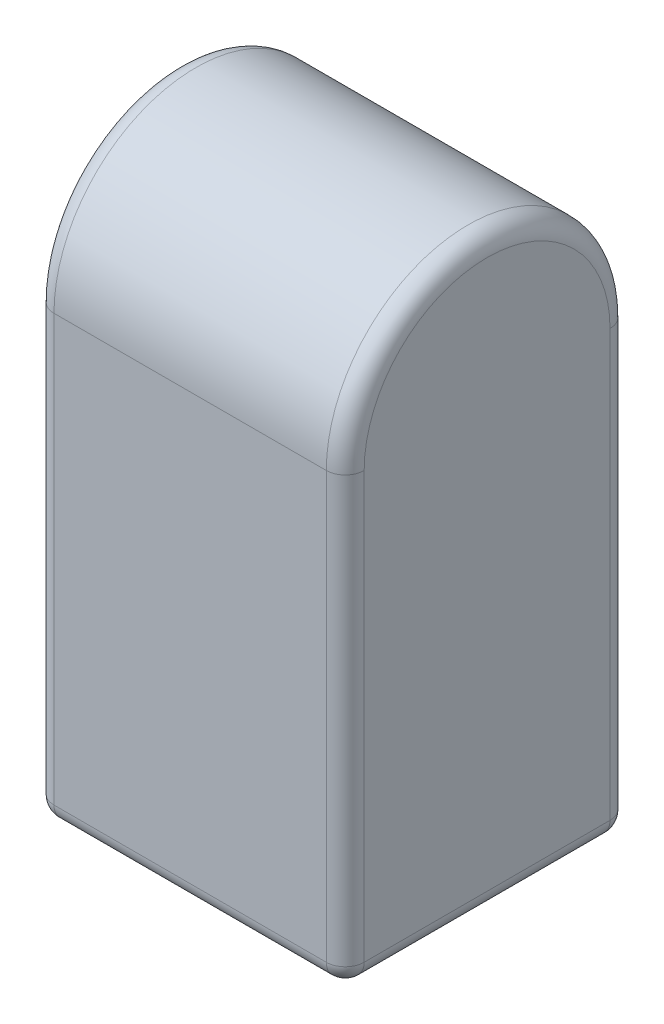
ISO-10303-21;
HEADER;
FILE_DESCRIPTION(('STEP AP214'),'2;1');
FILE_NAME('part.step','',(''),(''),'','','');
FILE_SCHEMA(('AUTOMOTIVE_DESIGN { 1 0 10303 214 1 1 1 1 }'));
ENDSEC;
DATA;
#1=APPLICATION_CONTEXT('core data for automotive mechanical design processes');
#2=APPLICATION_PROTOCOL_DEFINITION('international standard','automotive_design',2000,#1);
#3=PRODUCT_CONTEXT('',#1,'mechanical');
#4=PRODUCT('Part','Part','',(#3));
#5=PRODUCT_RELATED_PRODUCT_CATEGORY('part','',(#4));
#6=PRODUCT_DEFINITION_FORMATION('','',#4);
#7=PRODUCT_DEFINITION_CONTEXT('part definition',#1,'design');
#8=PRODUCT_DEFINITION('design','',#6,#7);
#9=PRODUCT_DEFINITION_SHAPE('','',#8);
#10=(LENGTH_UNIT() NAMED_UNIT(*) SI_UNIT(.MILLI.,.METRE.));
#11=(NAMED_UNIT(*) PLANE_ANGLE_UNIT() SI_UNIT($,.RADIAN.));
#12=(NAMED_UNIT(*) SI_UNIT($,.STERADIAN.) SOLID_ANGLE_UNIT());
#13=UNCERTAINTY_MEASURE_WITH_UNIT(LENGTH_MEASURE(1.E-05),#10,'distance_accuracy_value','');
#14=(GEOMETRIC_REPRESENTATION_CONTEXT(3) GLOBAL_UNCERTAINTY_ASSIGNED_CONTEXT((#13)) GLOBAL_UNIT_ASSIGNED_CONTEXT((#10,
#11,#12)) REPRESENTATION_CONTEXT('',''));
#15=CARTESIAN_POINT('',(0.,0.,0.));
#16=DIRECTION('',(0.,0.,1.));
#17=DIRECTION('',(1.,0.,0.));
#18=AXIS2_PLACEMENT_3D('',#15,#16,#17);
#19=CARTESIAN_POINT('',(16.383,46.99,0.));
#20=DIRECTION('',(-1.,0.,0.));
#21=DIRECTION('',(0.,0.,1.));
#22=AXIS2_PLACEMENT_3D('',#19,#20,#21);
#23=CYLINDRICAL_SURFACE('',#22,14.986);
#24=DIRECTION('',(-1.,0.,0.));
#25=VECTOR('',#24,1.);
#26=CARTESIAN_POINT('',(16.383,46.99,-14.986));
#27=LINE('',#26,#25);
#28=CARTESIAN_POINT('',(14.383,46.99,-14.986));
#29=VERTEX_POINT('',#28);
#30=CARTESIAN_POINT('',(-14.383,46.99,-14.986));
#31=VERTEX_POINT('',#30);
#32=EDGE_CURVE('E119',#29,#31,#27,.T.);
#33=ORIENTED_EDGE('',*,*,#32,.T.);
#34=CARTESIAN_POINT('',(-14.383,46.99,0.));
#35=DIRECTION('',(-1.,0.,0.));
#36=DIRECTION('',(0.,0.,1.));
#37=AXIS2_PLACEMENT_3D('',#34,#35,#36);
#38=CIRCLE('',#37,14.986);
#39=CARTESIAN_POINT('',(-14.383,46.99,14.986));
#40=VERTEX_POINT('',#39);
#41=EDGE_CURVE('E11',#31,#40,#38,.F.);
#42=ORIENTED_EDGE('',*,*,#41,.T.);
#43=DIRECTION('',(-1.,0.,0.));
#44=VECTOR('',#43,1.);
#45=CARTESIAN_POINT('',(16.383,46.99,14.986));
#46=LINE('',#45,#44);
#47=CARTESIAN_POINT('',(14.383,46.99,14.986));
#48=VERTEX_POINT('',#47);
#49=EDGE_CURVE('E121',#48,#40,#46,.T.);
#50=ORIENTED_EDGE('',*,*,#49,.F.);
#51=CARTESIAN_POINT('',(14.383,46.99,0.));
#52=DIRECTION('',(-1.,0.,0.));
#53=DIRECTION('',(0.,0.,1.));
#54=AXIS2_PLACEMENT_3D('',#51,#52,#53);
#55=CIRCLE('',#54,14.986);
#56=EDGE_CURVE('E49',#48,#29,#55,.T.);
#57=ORIENTED_EDGE('',*,*,#56,.T.);
#58=EDGE_LOOP('',(#33,#42,#50,#57));
#59=FACE_BOUND('',#58,.T.);
#60=ADVANCED_FACE('F39',(#59),#23,.T.);
#61=CARTESIAN_POINT('',(16.383,46.99,14.986));
#62=DIRECTION('',(0.,0.,-1.));
#63=DIRECTION('',(0.,1.,0.));
#64=AXIS2_PLACEMENT_3D('',#61,#62,#63);
#65=PLANE('',#64);
#66=ORIENTED_EDGE('',*,*,#49,.T.);
#67=DIRECTION('',(0.,-1.,0.));
#68=VECTOR('',#67,1.);
#69=CARTESIAN_POINT('',(-14.383,0.,14.986));
#70=LINE('',#69,#68);
#71=CARTESIAN_POINT('',(-14.383,2.,14.986));
#72=VERTEX_POINT('',#71);
#73=EDGE_CURVE('E182',#40,#72,#70,.T.);
#74=ORIENTED_EDGE('',*,*,#73,.T.);
#75=DIRECTION('',(-1.,0.,0.));
#76=VECTOR('',#75,1.);
#77=CARTESIAN_POINT('',(16.383,2.,14.986));
#78=LINE('',#77,#76);
#79=CARTESIAN_POINT('',(14.383,2.,14.986));
#80=VERTEX_POINT('',#79);
#81=EDGE_CURVE('E176',#72,#80,#78,.F.);
#82=ORIENTED_EDGE('',*,*,#81,.T.);
#83=DIRECTION('',(0.,-1.,0.));
#84=VECTOR('',#83,1.);
#85=CARTESIAN_POINT('',(14.383,46.99,14.986));
#86=LINE('',#85,#84);
#87=EDGE_CURVE('E179',#80,#48,#86,.F.);
#88=ORIENTED_EDGE('',*,*,#87,.T.);
#89=EDGE_LOOP('',(#66,#74,#82,#88));
#90=FACE_BOUND('',#89,.T.);
#91=ADVANCED_FACE('F288',(#90),#65,.F.);
#92=CARTESIAN_POINT('',(16.383,0.,14.986));
#93=DIRECTION('',(0.,1.,0.));
#94=DIRECTION('',(0.,0.,1.));
#95=AXIS2_PLACEMENT_3D('',#92,#93,#94);
#96=PLANE('',#95);
#97=DIRECTION('',(0.,0.,-1.));
#98=VECTOR('',#97,1.);
#99=CARTESIAN_POINT('',(14.383,0.,14.986));
#100=LINE('',#99,#98);
#101=CARTESIAN_POINT('',(14.383,0.,-12.986));
#102=VERTEX_POINT('',#101);
#103=CARTESIAN_POINT('',(14.383,0.,12.986));
#104=VERTEX_POINT('',#103);
#105=EDGE_CURVE('E57',#102,#104,#100,.F.);
#106=ORIENTED_EDGE('',*,*,#105,.T.);
#107=DIRECTION('',(-1.,0.,0.));
#108=VECTOR('',#107,1.);
#109=CARTESIAN_POINT('',(16.383,0.,12.986));
#110=LINE('',#109,#108);
#111=CARTESIAN_POINT('',(-14.383,0.,12.986));
#112=VERTEX_POINT('',#111);
#113=EDGE_CURVE('E127',#104,#112,#110,.T.);
#114=ORIENTED_EDGE('',*,*,#113,.T.);
#115=DIRECTION('',(0.,0.,-1.));
#116=VECTOR('',#115,1.);
#117=CARTESIAN_POINT('',(-14.383,0.,-14.986));
#118=LINE('',#117,#116);
#119=CARTESIAN_POINT('',(-14.383,0.,-12.986));
#120=VERTEX_POINT('',#119);
#121=EDGE_CURVE('E196',#112,#120,#118,.T.);
#122=ORIENTED_EDGE('',*,*,#121,.T.);
#123=DIRECTION('',(-1.,0.,0.));
#124=VECTOR('',#123,1.);
#125=CARTESIAN_POINT('',(16.383,0.,-12.986));
#126=LINE('',#125,#124);
#127=EDGE_CURVE('E62',#120,#102,#126,.F.);
#128=ORIENTED_EDGE('',*,*,#127,.T.);
#129=EDGE_LOOP('',(#106,#114,#122,#128));
#130=FACE_BOUND('',#129,.T.);
#131=ADVANCED_FACE('F302',(#130),#96,.F.);
#132=CARTESIAN_POINT('',(16.383,0.,-14.986));
#133=DIRECTION('',(0.,0.,1.));
#134=DIRECTION('',(0.,-1.,0.));
#135=AXIS2_PLACEMENT_3D('',#132,#133,#134);
#136=PLANE('',#135);
#137=DIRECTION('',(-1.,0.,0.));
#138=VECTOR('',#137,1.);
#139=CARTESIAN_POINT('',(16.383,2.00000000000001,-14.986));
#140=LINE('',#139,#138);
#141=CARTESIAN_POINT('',(14.383,2.00000000000001,-14.986));
#142=VERTEX_POINT('',#141);
#143=CARTESIAN_POINT('',(-14.383,2.00000000000001,-14.986));
#144=VERTEX_POINT('',#143);
#145=EDGE_CURVE('E155',#142,#144,#140,.T.);
#146=ORIENTED_EDGE('',*,*,#145,.T.);
#147=DIRECTION('',(0.,1.,0.));
#148=VECTOR('',#147,1.);
#149=CARTESIAN_POINT('',(-14.383,46.99,-14.986));
#150=LINE('',#149,#148);
#151=EDGE_CURVE('E136',#144,#31,#150,.T.);
#152=ORIENTED_EDGE('',*,*,#151,.T.);
#153=ORIENTED_EDGE('',*,*,#32,.F.);
#154=DIRECTION('',(0.,1.,0.));
#155=VECTOR('',#154,1.);
#156=CARTESIAN_POINT('',(14.383,0.,-14.986));
#157=LINE('',#156,#155);
#158=EDGE_CURVE('E133',#29,#142,#157,.F.);
#159=ORIENTED_EDGE('',*,*,#158,.T.);
#160=EDGE_LOOP('',(#146,#152,#153,#159));
#161=FACE_BOUND('',#160,.T.);
#162=ADVANCED_FACE('F131',(#161),#136,.F.);
#163=CARTESIAN_POINT('',(16.383,46.99,0.));
#164=DIRECTION('',(-1.,0.,0.));
#165=DIRECTION('',(0.,0.,1.));
#166=AXIS2_PLACEMENT_3D('',#163,#164,#165);
#167=PLANE('',#166);
#168=DIRECTION('',(0.,-1.,0.));
#169=VECTOR('',#168,1.);
#170=CARTESIAN_POINT('',(16.383,46.99,12.986));
#171=LINE('',#170,#169);
#172=CARTESIAN_POINT('',(16.383,46.99,12.986));
#173=VERTEX_POINT('',#172);
#174=CARTESIAN_POINT('',(16.383,2.,12.986));
#175=VERTEX_POINT('',#174);
#176=EDGE_CURVE('E187',#173,#175,#171,.T.);
#177=ORIENTED_EDGE('',*,*,#176,.T.);
#178=DIRECTION('',(0.,0.,-1.));
#179=VECTOR('',#178,1.);
#180=CARTESIAN_POINT('',(16.383,2.,0.));
#181=LINE('',#180,#179);
#182=CARTESIAN_POINT('',(16.383,2.,-12.986));
#183=VERTEX_POINT('',#182);
#184=EDGE_CURVE('E193',#175,#183,#181,.T.);
#185=ORIENTED_EDGE('',*,*,#184,.T.);
#186=DIRECTION('',(0.,1.,0.));
#187=VECTOR('',#186,1.);
#188=CARTESIAN_POINT('',(16.383,46.99,-12.986));
#189=LINE('',#188,#187);
#190=CARTESIAN_POINT('',(16.383,46.99,-12.986));
#191=VERTEX_POINT('',#190);
#192=EDGE_CURVE('E190',#183,#191,#189,.T.);
#193=ORIENTED_EDGE('',*,*,#192,.T.);
#194=CARTESIAN_POINT('',(16.383,46.99,0.));
#195=DIRECTION('',(-1.,0.,0.));
#196=DIRECTION('',(0.,0.,1.));
#197=AXIS2_PLACEMENT_3D('',#194,#195,#196);
#198=CIRCLE('',#197,12.986);
#199=EDGE_CURVE('E142',#191,#173,#198,.F.);
#200=ORIENTED_EDGE('',*,*,#199,.T.);
#201=EDGE_LOOP('',(#177,#185,#193,#200));
#202=FACE_BOUND('',#201,.T.);
#203=ADVANCED_FACE('F261',(#202),#167,.F.);
#204=CARTESIAN_POINT('',(-16.383,46.99,0.));
#205=DIRECTION('',(-1.,0.,0.));
#206=DIRECTION('',(0.,0.,1.));
#207=AXIS2_PLACEMENT_3D('',#204,#205,#206);
#208=PLANE('',#207);
#209=DIRECTION('',(0.,1.,0.));
#210=VECTOR('',#209,1.);
#211=CARTESIAN_POINT('',(-16.383,0.,-12.986));
#212=LINE('',#211,#210);
#213=CARTESIAN_POINT('',(-16.383,46.99,-12.986));
#214=VERTEX_POINT('',#213);
#215=CARTESIAN_POINT('',(-16.383,2.00000000000001,-12.986));
#216=VERTEX_POINT('',#215);
#217=EDGE_CURVE('E169',#214,#216,#212,.F.);
#218=ORIENTED_EDGE('',*,*,#217,.T.);
#219=DIRECTION('',(0.,0.,-1.));
#220=VECTOR('',#219,1.);
#221=CARTESIAN_POINT('',(-16.383,2.,14.986));
#222=LINE('',#221,#220);
#223=CARTESIAN_POINT('',(-16.383,2.,12.986));
#224=VERTEX_POINT('',#223);
#225=EDGE_CURVE('E173',#216,#224,#222,.F.);
#226=ORIENTED_EDGE('',*,*,#225,.T.);
#227=DIRECTION('',(0.,-1.,0.));
#228=VECTOR('',#227,1.);
#229=CARTESIAN_POINT('',(-16.383,46.99,12.986));
#230=LINE('',#229,#228);
#231=CARTESIAN_POINT('',(-16.383,46.99,12.986));
#232=VERTEX_POINT('',#231);
#233=EDGE_CURVE('E166',#224,#232,#230,.F.);
#234=ORIENTED_EDGE('',*,*,#233,.T.);
#235=CARTESIAN_POINT('',(-16.383,46.99,0.));
#236=DIRECTION('',(-1.,0.,0.));
#237=DIRECTION('',(0.,0.,1.));
#238=AXIS2_PLACEMENT_3D('',#235,#236,#237);
#239=CIRCLE('',#238,12.986);
#240=EDGE_CURVE('E159',#232,#214,#239,.T.);
#241=ORIENTED_EDGE('',*,*,#240,.T.);
#242=EDGE_LOOP('',(#218,#226,#234,#241));
#243=FACE_BOUND('',#242,.T.);
#244=ADVANCED_FACE('F306',(#243),#208,.T.);
#245=CARTESIAN_POINT('',(14.383,46.99,12.986));
#246=DIRECTION('',(0.,-1.,0.));
#247=DIRECTION('',(0.,0.,-1.));
#248=AXIS2_PLACEMENT_3D('',#245,#246,#247);
#249=CYLINDRICAL_SURFACE('',#248,2.);
#250=CARTESIAN_POINT('',(14.383,2.,12.986));
#251=DIRECTION('',(0.,-1.,0.));
#252=DIRECTION('',(0.,0.,-1.));
#253=AXIS2_PLACEMENT_3D('',#250,#251,#252);
#254=CIRCLE('',#253,2.);
#255=EDGE_CURVE('E249',#175,#80,#254,.T.);
#256=ORIENTED_EDGE('',*,*,#255,.F.);
#257=ORIENTED_EDGE('',*,*,#176,.F.);
#258=CARTESIAN_POINT('',(14.383,46.99,12.986));
#259=DIRECTION('',(0.,1.,0.));
#260=DIRECTION('',(0.,0.,1.));
#261=AXIS2_PLACEMENT_3D('',#258,#259,#260);
#262=CIRCLE('',#261,2.);
#263=EDGE_CURVE('E43',#48,#173,#262,.T.);
#264=ORIENTED_EDGE('',*,*,#263,.F.);
#265=ORIENTED_EDGE('',*,*,#87,.F.);
#266=EDGE_LOOP('',(#256,#257,#264,#265));
#267=FACE_BOUND('',#266,.T.);
#268=ADVANCED_FACE('F41',(#267),#249,.T.);
#269=CARTESIAN_POINT('',(14.383,46.99,0.));
#270=DIRECTION('',(-1.,0.,0.));
#271=DIRECTION('',(0.,0.,1.));
#272=AXIS2_PLACEMENT_3D('',#269,#270,#271);
#273=TOROIDAL_SURFACE('',#272,12.986,2.);
#274=ORIENTED_EDGE('',*,*,#263,.T.);
#275=ORIENTED_EDGE('',*,*,#199,.F.);
#276=CARTESIAN_POINT('',(14.383,46.99,-12.986));
#277=DIRECTION('',(0.,-1.,0.));
#278=DIRECTION('',(0.,0.,-1.));
#279=AXIS2_PLACEMENT_3D('',#276,#277,#278);
#280=CIRCLE('',#279,2.);
#281=EDGE_CURVE('E140',#29,#191,#280,.T.);
#282=ORIENTED_EDGE('',*,*,#281,.F.);
#283=ORIENTED_EDGE('',*,*,#56,.F.);
#284=EDGE_LOOP('',(#274,#275,#282,#283));
#285=FACE_BOUND('',#284,.T.);
#286=ADVANCED_FACE('F141',(#285),#273,.T.);
#287=CARTESIAN_POINT('',(14.383,2.,12.986));
#288=DIRECTION('',(1.,0.,0.));
#289=DIRECTION('',(0.,1.,0.));
#290=AXIS2_PLACEMENT_3D('',#287,#288,#289);
#291=SPHERICAL_SURFACE('',#290,2.);
#292=CARTESIAN_POINT('',(14.383,2.,12.986));
#293=DIRECTION('',(1.,0.,0.));
#294=DIRECTION('',(0.,0.,-1.));
#295=AXIS2_PLACEMENT_3D('',#292,#293,#294);
#296=CIRCLE('',#295,2.);
#297=EDGE_CURVE('E148',#104,#80,#296,.F.);
#298=ORIENTED_EDGE('',*,*,#297,.F.);
#299=CARTESIAN_POINT('',(14.383,2.,12.986));
#300=DIRECTION('',(0.,0.,1.));
#301=DIRECTION('',(1.,0.,0.));
#302=AXIS2_PLACEMENT_3D('',#299,#300,#301);
#303=CIRCLE('',#302,2.);
#304=EDGE_CURVE('E147',#175,#104,#303,.F.);
#305=ORIENTED_EDGE('',*,*,#304,.F.);
#306=ORIENTED_EDGE('',*,*,#255,.T.);
#307=EDGE_LOOP('',(#298,#305,#306));
#308=FACE_BOUND('',#307,.T.);
#309=ADVANCED_FACE('F345',(#308),#291,.T.);
#310=CARTESIAN_POINT('',(14.383,2.,0.));
#311=DIRECTION('',(0.,0.,-1.));
#312=DIRECTION('',(0.,1.,0.));
#313=AXIS2_PLACEMENT_3D('',#310,#311,#312);
#314=CYLINDRICAL_SURFACE('',#313,2.);
#315=ORIENTED_EDGE('',*,*,#304,.T.);
#316=ORIENTED_EDGE('',*,*,#105,.F.);
#317=CARTESIAN_POINT('',(14.383,2.,-12.986));
#318=DIRECTION('',(0.,0.,-1.));
#319=DIRECTION('',(-1.,0.,0.));
#320=AXIS2_PLACEMENT_3D('',#317,#318,#319);
#321=CIRCLE('',#320,2.);
#322=EDGE_CURVE('E241',#183,#102,#321,.T.);
#323=ORIENTED_EDGE('',*,*,#322,.F.);
#324=ORIENTED_EDGE('',*,*,#184,.F.);
#325=EDGE_LOOP('',(#315,#316,#323,#324));
#326=FACE_BOUND('',#325,.T.);
#327=ADVANCED_FACE('F265',(#326),#314,.T.);
#328=CARTESIAN_POINT('',(14.383,46.99,-12.986));
#329=DIRECTION('',(0.,1.,0.));
#330=DIRECTION('',(0.,0.,1.));
#331=AXIS2_PLACEMENT_3D('',#328,#329,#330);
#332=CYLINDRICAL_SURFACE('',#331,2.);
#333=ORIENTED_EDGE('',*,*,#281,.T.);
#334=ORIENTED_EDGE('',*,*,#192,.F.);
#335=CARTESIAN_POINT('',(14.383,2.00000000000001,-12.986));
#336=DIRECTION('',(0.,-1.,0.));
#337=DIRECTION('',(1.,0.,0.));
#338=AXIS2_PLACEMENT_3D('',#335,#336,#337);
#339=CIRCLE('',#338,2.);
#340=EDGE_CURVE('E152',#142,#183,#339,.T.);
#341=ORIENTED_EDGE('',*,*,#340,.F.);
#342=ORIENTED_EDGE('',*,*,#158,.F.);
#343=EDGE_LOOP('',(#333,#334,#341,#342));
#344=FACE_BOUND('',#343,.T.);
#345=ADVANCED_FACE('F150',(#344),#332,.T.);
#346=CARTESIAN_POINT('',(16.383,2.,12.986));
#347=DIRECTION('',(-1.,0.,0.));
#348=DIRECTION('',(0.,0.,1.));
#349=AXIS2_PLACEMENT_3D('',#346,#347,#348);
#350=CYLINDRICAL_SURFACE('',#349,2.);
#351=ORIENTED_EDGE('',*,*,#297,.T.);
#352=ORIENTED_EDGE('',*,*,#81,.F.);
#353=CARTESIAN_POINT('',(-14.383,2.,12.986));
#354=DIRECTION('',(-1.,0.,0.));
#355=DIRECTION('',(0.,0.,1.));
#356=AXIS2_PLACEMENT_3D('',#353,#354,#355);
#357=CIRCLE('',#356,2.);
#358=EDGE_CURVE('E235',#112,#72,#357,.T.);
#359=ORIENTED_EDGE('',*,*,#358,.F.);
#360=ORIENTED_EDGE('',*,*,#113,.F.);
#361=EDGE_LOOP('',(#351,#352,#359,#360));
#362=FACE_BOUND('',#361,.T.);
#363=ADVANCED_FACE('F301',(#362),#350,.T.);
#364=CARTESIAN_POINT('',(14.383,2.00000000000001,-12.986));
#365=DIRECTION('',(1.,0.,0.));
#366=DIRECTION('',(0.,1.,0.));
#367=AXIS2_PLACEMENT_3D('',#364,#365,#366);
#368=SPHERICAL_SURFACE('',#367,2.);
#369=ORIENTED_EDGE('',*,*,#340,.T.);
#370=ORIENTED_EDGE('',*,*,#322,.T.);
#371=CARTESIAN_POINT('',(14.383,2.00000000000001,-12.986));
#372=DIRECTION('',(1.,0.,0.));
#373=DIRECTION('',(0.,0.,-1.));
#374=AXIS2_PLACEMENT_3D('',#371,#372,#373);
#375=CIRCLE('',#374,2.);
#376=EDGE_CURVE('E227',#142,#102,#375,.F.);
#377=ORIENTED_EDGE('',*,*,#376,.F.);
#378=EDGE_LOOP('',(#369,#370,#377));
#379=FACE_BOUND('',#378,.T.);
#380=ADVANCED_FACE('F267',(#379),#368,.T.);
#381=CARTESIAN_POINT('',(-14.383,2.,12.986));
#382=DIRECTION('',(0.,-1.,0.));
#383=DIRECTION('',(1.,0.,0.));
#384=AXIS2_PLACEMENT_3D('',#381,#382,#383);
#385=SPHERICAL_SURFACE('',#384,2.);
#386=CARTESIAN_POINT('',(-14.383,2.,12.986));
#387=DIRECTION('',(0.,-1.,0.));
#388=DIRECTION('',(0.,0.,-1.));
#389=AXIS2_PLACEMENT_3D('',#386,#387,#388);
#390=CIRCLE('',#389,2.);
#391=EDGE_CURVE('E223',#224,#72,#390,.F.);
#392=ORIENTED_EDGE('',*,*,#391,.F.);
#393=CARTESIAN_POINT('',(-14.383,2.,12.986));
#394=DIRECTION('',(0.,0.,1.));
#395=DIRECTION('',(1.,0.,0.));
#396=AXIS2_PLACEMENT_3D('',#393,#394,#395);
#397=CIRCLE('',#396,2.);
#398=EDGE_CURVE('E231',#112,#224,#397,.F.);
#399=ORIENTED_EDGE('',*,*,#398,.F.);
#400=ORIENTED_EDGE('',*,*,#358,.T.);
#401=EDGE_LOOP('',(#392,#399,#400));
#402=FACE_BOUND('',#401,.T.);
#403=ADVANCED_FACE('F297',(#402),#385,.T.);
#404=CARTESIAN_POINT('',(-14.383,2.,14.986));
#405=DIRECTION('',(0.,0.,1.));
#406=DIRECTION('',(0.,-1.,0.));
#407=AXIS2_PLACEMENT_3D('',#404,#405,#406);
#408=CYLINDRICAL_SURFACE('',#407,2.);
#409=ORIENTED_EDGE('',*,*,#398,.T.);
#410=ORIENTED_EDGE('',*,*,#225,.F.);
#411=CARTESIAN_POINT('',(-14.383,2.00000000000001,-12.986));
#412=DIRECTION('',(0.,0.,-1.));
#413=DIRECTION('',(-1.,0.,0.));
#414=AXIS2_PLACEMENT_3D('',#411,#412,#413);
#415=CIRCLE('',#414,2.);
#416=EDGE_CURVE('E219',#120,#216,#415,.T.);
#417=ORIENTED_EDGE('',*,*,#416,.F.);
#418=ORIENTED_EDGE('',*,*,#121,.F.);
#419=EDGE_LOOP('',(#409,#410,#417,#418));
#420=FACE_BOUND('',#419,.T.);
#421=ADVANCED_FACE('F304',(#420),#408,.T.);
#422=CARTESIAN_POINT('',(16.383,2.00000000000001,-12.986));
#423=DIRECTION('',(-1.,0.,0.));
#424=DIRECTION('',(0.,0.,1.));
#425=AXIS2_PLACEMENT_3D('',#422,#423,#424);
#426=CYLINDRICAL_SURFACE('',#425,2.);
#427=ORIENTED_EDGE('',*,*,#376,.T.);
#428=ORIENTED_EDGE('',*,*,#127,.F.);
#429=CARTESIAN_POINT('',(-14.383,2.00000000000001,-12.986));
#430=DIRECTION('',(-1.,0.,0.));
#431=DIRECTION('',(0.,0.,1.));
#432=AXIS2_PLACEMENT_3D('',#429,#430,#431);
#433=CIRCLE('',#432,2.);
#434=EDGE_CURVE('E215',#144,#120,#433,.T.);
#435=ORIENTED_EDGE('',*,*,#434,.F.);
#436=ORIENTED_EDGE('',*,*,#145,.F.);
#437=EDGE_LOOP('',(#427,#428,#435,#436));
#438=FACE_BOUND('',#437,.T.);
#439=ADVANCED_FACE('F271',(#438),#426,.T.);
#440=CARTESIAN_POINT('',(-14.383,46.99,12.986));
#441=DIRECTION('',(0.,1.,0.));
#442=DIRECTION('',(0.,0.,1.));
#443=AXIS2_PLACEMENT_3D('',#440,#441,#442);
#444=CYLINDRICAL_SURFACE('',#443,2.);
#445=ORIENTED_EDGE('',*,*,#391,.T.);
#446=ORIENTED_EDGE('',*,*,#73,.F.);
#447=CARTESIAN_POINT('',(-14.383,46.99,12.986));
#448=DIRECTION('',(0.,1.,0.));
#449=DIRECTION('',(0.,0.,1.));
#450=AXIS2_PLACEMENT_3D('',#447,#448,#449);
#451=CIRCLE('',#450,2.);
#452=EDGE_CURVE('E211',#232,#40,#451,.T.);
#453=ORIENTED_EDGE('',*,*,#452,.F.);
#454=ORIENTED_EDGE('',*,*,#233,.F.);
#455=EDGE_LOOP('',(#445,#446,#453,#454));
#456=FACE_BOUND('',#455,.T.);
#457=ADVANCED_FACE('F292',(#456),#444,.T.);
#458=CARTESIAN_POINT('',(-14.383,2.00000000000001,-12.986));
#459=DIRECTION('',(0.,-1.,0.));
#460=DIRECTION('',(1.,0.,0.));
#461=AXIS2_PLACEMENT_3D('',#458,#459,#460);
#462=SPHERICAL_SURFACE('',#461,2.);
#463=ORIENTED_EDGE('',*,*,#434,.T.);
#464=ORIENTED_EDGE('',*,*,#416,.T.);
#465=CARTESIAN_POINT('',(-14.383,2.00000000000001,-12.986));
#466=DIRECTION('',(0.,-1.,0.));
#467=DIRECTION('',(0.,0.,-1.));
#468=AXIS2_PLACEMENT_3D('',#465,#466,#467);
#469=CIRCLE('',#468,2.);
#470=EDGE_CURVE('E208',#144,#216,#469,.F.);
#471=ORIENTED_EDGE('',*,*,#470,.F.);
#472=EDGE_LOOP('',(#463,#464,#471));
#473=FACE_BOUND('',#472,.T.);
#474=ADVANCED_FACE('F275',(#473),#462,.T.);
#475=CARTESIAN_POINT('',(-14.383,46.99,0.));
#476=DIRECTION('',(-1.,0.,0.));
#477=DIRECTION('',(0.,0.,1.));
#478=AXIS2_PLACEMENT_3D('',#475,#476,#477);
#479=TOROIDAL_SURFACE('',#478,12.986,2.);
#480=ORIENTED_EDGE('',*,*,#452,.T.);
#481=ORIENTED_EDGE('',*,*,#41,.F.);
#482=CARTESIAN_POINT('',(-14.383,46.99,-12.986));
#483=DIRECTION('',(0.,-1.,0.));
#484=DIRECTION('',(0.,0.,-1.));
#485=AXIS2_PLACEMENT_3D('',#482,#483,#484);
#486=CIRCLE('',#485,2.);
#487=EDGE_CURVE('E205',#214,#31,#486,.T.);
#488=ORIENTED_EDGE('',*,*,#487,.F.);
#489=ORIENTED_EDGE('',*,*,#240,.F.);
#490=EDGE_LOOP('',(#480,#481,#488,#489));
#491=FACE_BOUND('',#490,.T.);
#492=ADVANCED_FACE('F284',(#491),#479,.T.);
#493=CARTESIAN_POINT('',(-14.383,0.,-12.986));
#494=DIRECTION('',(0.,-1.,0.));
#495=DIRECTION('',(0.,0.,-1.));
#496=AXIS2_PLACEMENT_3D('',#493,#494,#495);
#497=CYLINDRICAL_SURFACE('',#496,2.);
#498=ORIENTED_EDGE('',*,*,#470,.T.);
#499=ORIENTED_EDGE('',*,*,#217,.F.);
#500=ORIENTED_EDGE('',*,*,#487,.T.);
#501=ORIENTED_EDGE('',*,*,#151,.F.);
#502=EDGE_LOOP('',(#498,#499,#500,#501));
#503=FACE_BOUND('',#502,.T.);
#504=ADVANCED_FACE('F279',(#503),#497,.T.);
#505=CLOSED_SHELL('',(#60,#91,#131,#162,#203,#244,#268,#286,#309,#327,#345,#363,#380,#403,#421,
#439,#457,#474,#492,#504));
#506=MANIFOLD_SOLID_BREP('B2',#505);
#507=ADVANCED_BREP_SHAPE_REPRESENTATION('',(#18,#506),#14);
#508=SHAPE_DEFINITION_REPRESENTATION(#9,#507);
ENDSEC;
END-ISO-10303-21;
